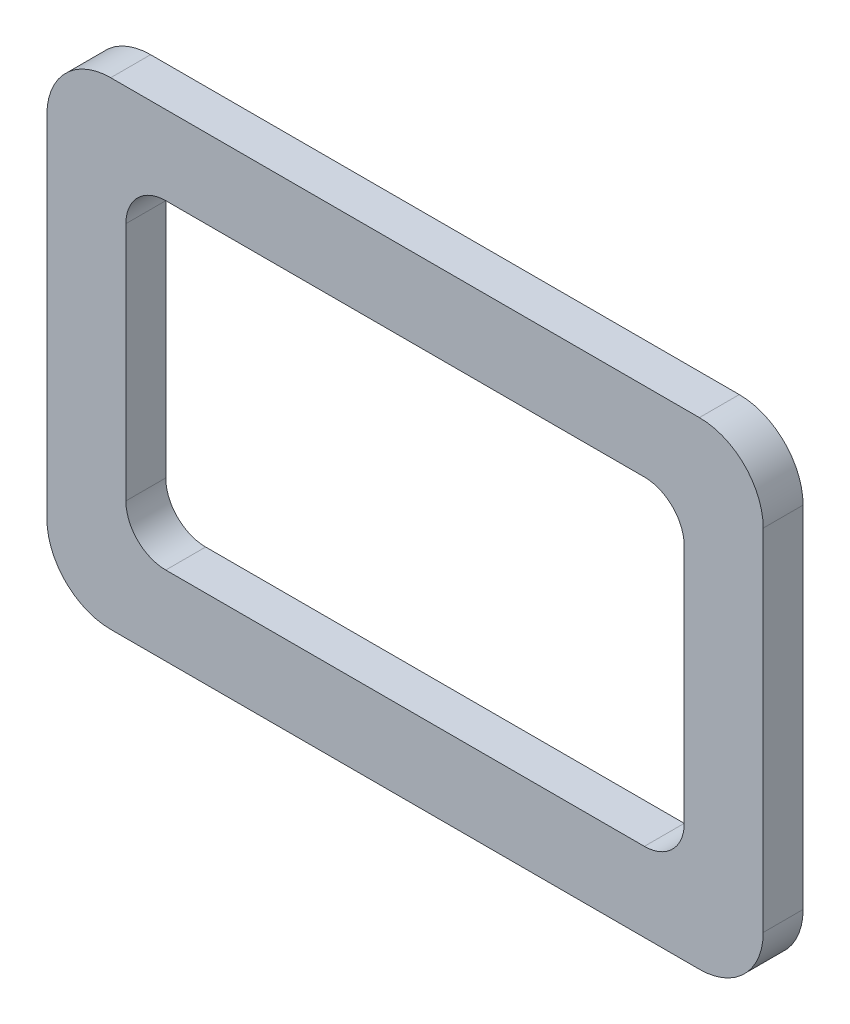
ISO-10303-21;
HEADER;
FILE_DESCRIPTION(('STEP AP214'),'2;1');
FILE_NAME('part.step','',(''),(''),'','','');
FILE_SCHEMA(('AUTOMOTIVE_DESIGN { 1 0 10303 214 1 1 1 1 }'));
ENDSEC;
DATA;
#1=APPLICATION_CONTEXT('core data for automotive mechanical design processes');
#2=APPLICATION_PROTOCOL_DEFINITION('international standard','automotive_design',2000,#1);
#3=PRODUCT_CONTEXT('',#1,'mechanical');
#4=PRODUCT('Part','Part','',(#3));
#5=PRODUCT_RELATED_PRODUCT_CATEGORY('part','',(#4));
#6=PRODUCT_DEFINITION_FORMATION('','',#4);
#7=PRODUCT_DEFINITION_CONTEXT('part definition',#1,'design');
#8=PRODUCT_DEFINITION('design','',#6,#7);
#9=PRODUCT_DEFINITION_SHAPE('','',#8);
#10=(LENGTH_UNIT() NAMED_UNIT(*) SI_UNIT(.MILLI.,.METRE.));
#11=(NAMED_UNIT(*) PLANE_ANGLE_UNIT() SI_UNIT($,.RADIAN.));
#12=(NAMED_UNIT(*) SI_UNIT($,.STERADIAN.) SOLID_ANGLE_UNIT());
#13=UNCERTAINTY_MEASURE_WITH_UNIT(LENGTH_MEASURE(1.E-05),#10,'distance_accuracy_value','');
#14=(GEOMETRIC_REPRESENTATION_CONTEXT(3) GLOBAL_UNCERTAINTY_ASSIGNED_CONTEXT((#13)) GLOBAL_UNIT_ASSIGNED_CONTEXT((#10,
#11,#12)) REPRESENTATION_CONTEXT('',''));
#15=CARTESIAN_POINT('',(0.,0.,0.));
#16=DIRECTION('',(0.,0.,1.));
#17=DIRECTION('',(1.,0.,0.));
#18=AXIS2_PLACEMENT_3D('',#15,#16,#17);
#19=CARTESIAN_POINT('',(49.5119476559096,-3.74892720306512,5.));
#20=DIRECTION('',(0.,-1.,0.));
#21=DIRECTION('',(1.,0.,0.));
#22=AXIS2_PLACEMENT_3D('',#19,#20,#21);
#23=PLANE('',#22);
#24=DIRECTION('',(-1.,0.,0.));
#25=VECTOR('',#24,1.);
#26=CARTESIAN_POINT('',(49.5119476559096,-3.74892720306512,5.));
#27=LINE('',#26,#25);
#28=CARTESIAN_POINT('',(79.5119476559096,-3.74892720306512,5.));
#29=VERTEX_POINT('',#28);
#30=CARTESIAN_POINT('',(19.5119476559096,-3.74892720306512,5.));
#31=VERTEX_POINT('',#30);
#32=EDGE_CURVE('E308',#29,#31,#27,.T.);
#33=ORIENTED_EDGE('',*,*,#32,.F.);
#34=DIRECTION('',(0.,0.,-1.));
#35=VECTOR('',#34,1.);
#36=CARTESIAN_POINT('',(79.5119476559096,-3.74892720306512,5.));
#37=LINE('',#36,#35);
#38=CARTESIAN_POINT('',(79.5119476559096,-3.74892720306512,0.));
#39=VERTEX_POINT('',#38);
#40=EDGE_CURVE('E240',#29,#39,#37,.T.);
#41=ORIENTED_EDGE('',*,*,#40,.T.);
#42=DIRECTION('',(-1.,0.,0.));
#43=VECTOR('',#42,1.);
#44=CARTESIAN_POINT('',(49.5119476559096,-3.74892720306512,0.));
#45=LINE('',#44,#43);
#46=CARTESIAN_POINT('',(19.5119476559096,-3.74892720306512,0.));
#47=VERTEX_POINT('',#46);
#48=EDGE_CURVE('E295',#39,#47,#45,.T.);
#49=ORIENTED_EDGE('',*,*,#48,.T.);
#50=DIRECTION('',(0.,0.,-1.));
#51=VECTOR('',#50,1.);
#52=CARTESIAN_POINT('',(19.5119476559096,-3.74892720306512,5.));
#53=LINE('',#52,#51);
#54=EDGE_CURVE('E237',#47,#31,#53,.F.);
#55=ORIENTED_EDGE('',*,*,#54,.T.);
#56=EDGE_LOOP('',(#33,#41,#49,#55));
#57=FACE_BOUND('',#56,.T.);
#58=ADVANCED_FACE('F43',(#57),#23,.F.);
#59=CARTESIAN_POINT('',(14.5119476559096,-3.74892720306512,5.));
#60=DIRECTION('',(-1.,0.,0.));
#61=DIRECTION('',(0.,0.,1.));
#62=AXIS2_PLACEMENT_3D('',#59,#60,#61);
#63=PLANE('',#62);
#64=DIRECTION('',(0.,1.,0.));
#65=VECTOR('',#64,1.);
#66=CARTESIAN_POINT('',(14.5119476559096,-3.74892720306512,5.));
#67=LINE('',#66,#65);
#68=CARTESIAN_POINT('',(14.5119476559096,1.25107279693488,5.));
#69=VERTEX_POINT('',#68);
#70=CARTESIAN_POINT('',(14.5119476559096,31.3510727969349,5.));
#71=VERTEX_POINT('',#70);
#72=EDGE_CURVE('E302',#69,#71,#67,.T.);
#73=ORIENTED_EDGE('',*,*,#72,.F.);
#74=DIRECTION('',(0.,0.,-1.));
#75=VECTOR('',#74,1.);
#76=CARTESIAN_POINT('',(14.5119476559096,1.25107279693488,0.));
#77=LINE('',#76,#75);
#78=CARTESIAN_POINT('',(14.5119476559096,1.25107279693488,0.));
#79=VERTEX_POINT('',#78);
#80=EDGE_CURVE('E254',#69,#79,#77,.T.);
#81=ORIENTED_EDGE('',*,*,#80,.T.);
#82=DIRECTION('',(0.,1.,0.));
#83=VECTOR('',#82,1.);
#84=CARTESIAN_POINT('',(14.5119476559096,-3.74892720306512,0.));
#85=LINE('',#84,#83);
#86=CARTESIAN_POINT('',(14.5119476559096,31.3510727969349,0.));
#87=VERTEX_POINT('',#86);
#88=EDGE_CURVE('E285',#79,#87,#85,.T.);
#89=ORIENTED_EDGE('',*,*,#88,.T.);
#90=DIRECTION('',(0.,0.,-1.));
#91=VECTOR('',#90,1.);
#92=CARTESIAN_POINT('',(14.5119476559096,31.3510727969349,5.));
#93=LINE('',#92,#91);
#94=EDGE_CURVE('E251',#87,#71,#93,.F.);
#95=ORIENTED_EDGE('',*,*,#94,.T.);
#96=EDGE_LOOP('',(#73,#81,#89,#95));
#97=FACE_BOUND('',#96,.T.);
#98=ADVANCED_FACE('F292',(#97),#63,.F.);
#99=CARTESIAN_POINT('',(49.5119476559096,36.3510727969349,5.));
#100=DIRECTION('',(0.,1.,0.));
#101=DIRECTION('',(-1.,0.,0.));
#102=AXIS2_PLACEMENT_3D('',#99,#100,#101);
#103=PLANE('',#102);
#104=DIRECTION('',(1.,0.,0.));
#105=VECTOR('',#104,1.);
#106=CARTESIAN_POINT('',(49.5119476559096,36.3510727969349,0.));
#107=LINE('',#106,#105);
#108=CARTESIAN_POINT('',(19.5119476559096,36.3510727969349,0.));
#109=VERTEX_POINT('',#108);
#110=CARTESIAN_POINT('',(79.5119476559096,36.3510727969349,0.));
#111=VERTEX_POINT('',#110);
#112=EDGE_CURVE('E286',#109,#111,#107,.T.);
#113=ORIENTED_EDGE('',*,*,#112,.T.);
#114=DIRECTION('',(0.,0.,-1.));
#115=VECTOR('',#114,1.);
#116=CARTESIAN_POINT('',(79.5119476559096,36.3510727969349,5.));
#117=LINE('',#116,#115);
#118=CARTESIAN_POINT('',(79.5119476559096,36.3510727969349,5.));
#119=VERTEX_POINT('',#118);
#120=EDGE_CURVE('E59',#111,#119,#117,.F.);
#121=ORIENTED_EDGE('',*,*,#120,.T.);
#122=DIRECTION('',(1.,0.,0.));
#123=VECTOR('',#122,1.);
#124=CARTESIAN_POINT('',(49.5119476559096,36.3510727969349,5.));
#125=LINE('',#124,#123);
#126=CARTESIAN_POINT('',(19.5119476559096,36.3510727969349,5.));
#127=VERTEX_POINT('',#126);
#128=EDGE_CURVE('E298',#127,#119,#125,.T.);
#129=ORIENTED_EDGE('',*,*,#128,.F.);
#130=DIRECTION('',(0.,0.,-1.));
#131=VECTOR('',#130,1.);
#132=CARTESIAN_POINT('',(19.5119476559096,36.3510727969349,0.));
#133=LINE('',#132,#131);
#134=EDGE_CURVE('E258',#127,#109,#133,.T.);
#135=ORIENTED_EDGE('',*,*,#134,.T.);
#136=EDGE_LOOP('',(#113,#121,#129,#135));
#137=FACE_BOUND('',#136,.T.);
#138=ADVANCED_FACE('F297',(#137),#103,.F.);
#139=CARTESIAN_POINT('',(49.5119476559096,46.2510727969349,5.));
#140=DIRECTION('',(0.,-1.,0.));
#141=DIRECTION('',(1.,0.,0.));
#142=AXIS2_PLACEMENT_3D('',#139,#140,#141);
#143=PLANE('',#142);
#144=DIRECTION('',(-1.,0.,0.));
#145=VECTOR('',#144,1.);
#146=CARTESIAN_POINT('',(49.5119476559096,46.2510727969349,5.));
#147=LINE('',#146,#145);
#148=CARTESIAN_POINT('',(86.4119476559096,46.2510727969349,5.));
#149=VERTEX_POINT('',#148);
#150=CARTESIAN_POINT('',(12.6119476559096,46.2510727969349,5.));
#151=VERTEX_POINT('',#150);
#152=EDGE_CURVE('E301',#149,#151,#147,.T.);
#153=ORIENTED_EDGE('',*,*,#152,.F.);
#154=DIRECTION('',(0.,0.,-1.));
#155=VECTOR('',#154,1.);
#156=CARTESIAN_POINT('',(86.4119476559096,46.2510727969349,0.));
#157=LINE('',#156,#155);
#158=CARTESIAN_POINT('',(86.4119476559096,46.2510727969349,0.));
#159=VERTEX_POINT('',#158);
#160=EDGE_CURVE('E227',#149,#159,#157,.T.);
#161=ORIENTED_EDGE('',*,*,#160,.T.);
#162=DIRECTION('',(-1.,0.,0.));
#163=VECTOR('',#162,1.);
#164=CARTESIAN_POINT('',(49.5119476559096,46.2510727969349,0.));
#165=LINE('',#164,#163);
#166=CARTESIAN_POINT('',(12.6119476559096,46.2510727969349,0.));
#167=VERTEX_POINT('',#166);
#168=EDGE_CURVE('E163',#159,#167,#165,.T.);
#169=ORIENTED_EDGE('',*,*,#168,.T.);
#170=DIRECTION('',(0.,0.,-1.));
#171=VECTOR('',#170,1.);
#172=CARTESIAN_POINT('',(12.6119476559096,46.2510727969349,5.));
#173=LINE('',#172,#171);
#174=EDGE_CURVE('E224',#167,#151,#173,.F.);
#175=ORIENTED_EDGE('',*,*,#174,.T.);
#176=EDGE_LOOP('',(#153,#161,#169,#175));
#177=FACE_BOUND('',#176,.T.);
#178=ADVANCED_FACE('F366',(#177),#143,.F.);
#179=CARTESIAN_POINT('',(4.61194765590964,-13.6489272030651,5.));
#180=DIRECTION('',(1.,0.,0.));
#181=DIRECTION('',(0.,0.,-1.));
#182=AXIS2_PLACEMENT_3D('',#179,#180,#181);
#183=PLANE('',#182);
#184=DIRECTION('',(0.,-1.,0.));
#185=VECTOR('',#184,1.);
#186=CARTESIAN_POINT('',(4.61194765590964,-13.6489272030651,0.));
#187=LINE('',#186,#185);
#188=CARTESIAN_POINT('',(4.61194765590964,38.2510727969349,0.));
#189=VERTEX_POINT('',#188);
#190=CARTESIAN_POINT('',(4.61194765590964,-5.64892720306513,0.));
#191=VERTEX_POINT('',#190);
#192=EDGE_CURVE('E322',#189,#191,#187,.T.);
#193=ORIENTED_EDGE('',*,*,#192,.T.);
#194=DIRECTION('',(0.,0.,-1.));
#195=VECTOR('',#194,1.);
#196=CARTESIAN_POINT('',(4.61194765590964,-5.64892720306513,5.));
#197=LINE('',#196,#195);
#198=CARTESIAN_POINT('',(4.61194765590964,-5.64892720306513,5.));
#199=VERTEX_POINT('',#198);
#200=EDGE_CURVE('E234',#191,#199,#197,.F.);
#201=ORIENTED_EDGE('',*,*,#200,.T.);
#202=DIRECTION('',(0.,-1.,0.));
#203=VECTOR('',#202,1.);
#204=CARTESIAN_POINT('',(4.61194765590964,-13.6489272030651,5.));
#205=LINE('',#204,#203);
#206=CARTESIAN_POINT('',(4.61194765590964,38.2510727969349,5.));
#207=VERTEX_POINT('',#206);
#208=EDGE_CURVE('E194',#207,#199,#205,.T.);
#209=ORIENTED_EDGE('',*,*,#208,.F.);
#210=DIRECTION('',(0.,0.,-1.));
#211=VECTOR('',#210,1.);
#212=CARTESIAN_POINT('',(4.61194765590964,38.2510727969349,5.));
#213=LINE('',#212,#211);
#214=EDGE_CURVE('E230',#207,#189,#213,.T.);
#215=ORIENTED_EDGE('',*,*,#214,.T.);
#216=EDGE_LOOP('',(#193,#201,#209,#215));
#217=FACE_BOUND('',#216,.T.);
#218=ADVANCED_FACE('F360',(#217),#183,.F.);
#219=CARTESIAN_POINT('',(49.5119476559096,-13.6489272030651,5.));
#220=DIRECTION('',(0.,1.,0.));
#221=DIRECTION('',(-1.,0.,0.));
#222=AXIS2_PLACEMENT_3D('',#219,#220,#221);
#223=PLANE('',#222);
#224=DIRECTION('',(1.,0.,0.));
#225=VECTOR('',#224,1.);
#226=CARTESIAN_POINT('',(49.5119476559096,-13.6489272030651,0.));
#227=LINE('',#226,#225);
#228=CARTESIAN_POINT('',(12.6119476559096,-13.6489272030651,0.));
#229=VERTEX_POINT('',#228);
#230=CARTESIAN_POINT('',(86.4119476559096,-13.6489272030651,0.));
#231=VERTEX_POINT('',#230);
#232=EDGE_CURVE('E197',#229,#231,#227,.T.);
#233=ORIENTED_EDGE('',*,*,#232,.T.);
#234=DIRECTION('',(0.,0.,-1.));
#235=VECTOR('',#234,1.);
#236=CARTESIAN_POINT('',(86.4119476559096,-13.6489272030651,5.));
#237=LINE('',#236,#235);
#238=CARTESIAN_POINT('',(86.4119476559096,-13.6489272030651,5.));
#239=VERTEX_POINT('',#238);
#240=EDGE_CURVE('E210',#231,#239,#237,.F.);
#241=ORIENTED_EDGE('',*,*,#240,.T.);
#242=DIRECTION('',(1.,0.,0.));
#243=VECTOR('',#242,1.);
#244=CARTESIAN_POINT('',(49.5119476559096,-13.6489272030651,5.));
#245=LINE('',#244,#243);
#246=CARTESIAN_POINT('',(12.6119476559096,-13.6489272030651,5.));
#247=VERTEX_POINT('',#246);
#248=EDGE_CURVE('E187',#247,#239,#245,.T.);
#249=ORIENTED_EDGE('',*,*,#248,.F.);
#250=DIRECTION('',(0.,0.,-1.));
#251=VECTOR('',#250,1.);
#252=CARTESIAN_POINT('',(12.6119476559096,-13.6489272030651,5.));
#253=LINE('',#252,#251);
#254=EDGE_CURVE('E206',#247,#229,#253,.T.);
#255=ORIENTED_EDGE('',*,*,#254,.T.);
#256=EDGE_LOOP('',(#233,#241,#249,#255));
#257=FACE_BOUND('',#256,.T.);
#258=ADVANCED_FACE('F355',(#257),#223,.F.);
#259=CARTESIAN_POINT('',(0.,0.,5.));
#260=DIRECTION('',(0.,0.,1.));
#261=DIRECTION('',(1.,0.,0.));
#262=AXIS2_PLACEMENT_3D('',#259,#260,#261);
#263=PLANE('',#262);
#264=ORIENTED_EDGE('',*,*,#248,.T.);
#265=CARTESIAN_POINT('',(86.4119476559096,-5.64892720306512,5.));
#266=DIRECTION('',(0.,0.,1.));
#267=DIRECTION('',(1.,0.,0.));
#268=AXIS2_PLACEMENT_3D('',#265,#266,#267);
#269=CIRCLE('',#268,8.);
#270=CARTESIAN_POINT('',(94.4119476559096,-5.64892720306512,5.));
#271=VERTEX_POINT('',#270);
#272=EDGE_CURVE('E221',#239,#271,#269,.T.);
#273=ORIENTED_EDGE('',*,*,#272,.T.);
#274=DIRECTION('',(0.,-1.,0.));
#275=VECTOR('',#274,1.);
#276=CARTESIAN_POINT('',(94.4119476559096,-13.6489272030651,5.));
#277=LINE('',#276,#275);
#278=CARTESIAN_POINT('',(94.4119476559096,38.2510727969349,5.));
#279=VERTEX_POINT('',#278);
#280=EDGE_CURVE('E340',#279,#271,#277,.T.);
#281=ORIENTED_EDGE('',*,*,#280,.F.);
#282=CARTESIAN_POINT('',(86.4119476559096,38.2510727969349,5.));
#283=DIRECTION('',(0.,0.,1.));
#284=DIRECTION('',(1.,0.,0.));
#285=AXIS2_PLACEMENT_3D('',#282,#283,#284);
#286=CIRCLE('',#285,8.);
#287=EDGE_CURVE('E185',#279,#149,#286,.T.);
#288=ORIENTED_EDGE('',*,*,#287,.T.);
#289=ORIENTED_EDGE('',*,*,#152,.T.);
#290=CARTESIAN_POINT('',(12.6119476559096,38.2510727969349,5.));
#291=DIRECTION('',(0.,0.,1.));
#292=DIRECTION('',(1.,0.,0.));
#293=AXIS2_PLACEMENT_3D('',#290,#291,#292);
#294=CIRCLE('',#293,8.);
#295=EDGE_CURVE('E213',#151,#207,#294,.T.);
#296=ORIENTED_EDGE('',*,*,#295,.T.);
#297=ORIENTED_EDGE('',*,*,#208,.T.);
#298=CARTESIAN_POINT('',(12.6119476559096,-5.64892720306512,5.));
#299=DIRECTION('',(0.,0.,1.));
#300=DIRECTION('',(1.,0.,0.));
#301=AXIS2_PLACEMENT_3D('',#298,#299,#300);
#302=CIRCLE('',#301,8.);
#303=EDGE_CURVE('E216',#199,#247,#302,.T.);
#304=ORIENTED_EDGE('',*,*,#303,.T.);
#305=EDGE_LOOP('',(#264,#273,#281,#288,#289,#296,#297,#304));
#306=FACE_BOUND('',#305,.T.);
#307=DIRECTION('',(0.,1.,0.));
#308=VECTOR('',#307,1.);
#309=CARTESIAN_POINT('',(84.5119476559096,-3.74892720306512,5.));
#310=LINE('',#309,#308);
#311=CARTESIAN_POINT('',(84.5119476559096,1.25107279693488,5.));
#312=VERTEX_POINT('',#311);
#313=CARTESIAN_POINT('',(84.5119476559096,31.3510727969349,5.));
#314=VERTEX_POINT('',#313);
#315=EDGE_CURVE('E317',#312,#314,#310,.T.);
#316=ORIENTED_EDGE('',*,*,#315,.F.);
#317=CARTESIAN_POINT('',(79.5119476559096,1.25107279693488,5.));
#318=DIRECTION('',(0.,0.,1.));
#319=DIRECTION('',(1.,0.,0.));
#320=AXIS2_PLACEMENT_3D('',#317,#318,#319);
#321=CIRCLE('',#320,5.);
#322=EDGE_CURVE('E267',#312,#29,#321,.F.);
#323=ORIENTED_EDGE('',*,*,#322,.T.);
#324=ORIENTED_EDGE('',*,*,#32,.T.);
#325=CARTESIAN_POINT('',(19.5119476559096,1.25107279693488,5.));
#326=DIRECTION('',(0.,0.,1.));
#327=DIRECTION('',(1.,0.,0.));
#328=AXIS2_PLACEMENT_3D('',#325,#326,#327);
#329=CIRCLE('',#328,5.);
#330=EDGE_CURVE('E273',#31,#69,#329,.F.);
#331=ORIENTED_EDGE('',*,*,#330,.T.);
#332=ORIENTED_EDGE('',*,*,#72,.T.);
#333=CARTESIAN_POINT('',(19.5119476559096,31.3510727969349,5.));
#334=DIRECTION('',(0.,0.,1.));
#335=DIRECTION('',(1.,0.,0.));
#336=AXIS2_PLACEMENT_3D('',#333,#334,#335);
#337=CIRCLE('',#336,5.);
#338=EDGE_CURVE('E11',#71,#127,#337,.F.);
#339=ORIENTED_EDGE('',*,*,#338,.T.);
#340=ORIENTED_EDGE('',*,*,#128,.T.);
#341=CARTESIAN_POINT('',(79.5119476559096,31.3510727969349,5.));
#342=DIRECTION('',(0.,0.,1.));
#343=DIRECTION('',(1.,0.,0.));
#344=AXIS2_PLACEMENT_3D('',#341,#342,#343);
#345=CIRCLE('',#344,5.);
#346=EDGE_CURVE('E279',#119,#314,#345,.F.);
#347=ORIENTED_EDGE('',*,*,#346,.T.);
#348=EDGE_LOOP('',(#316,#323,#324,#331,#332,#339,#340,#347));
#349=FACE_BOUND('',#348,.T.);
#350=ADVANCED_FACE('F356',(#306,#349),#263,.T.);
#351=CARTESIAN_POINT('',(0.,0.,0.));
#352=DIRECTION('',(0.,0.,1.));
#353=DIRECTION('',(1.,0.,0.));
#354=AXIS2_PLACEMENT_3D('',#351,#352,#353);
#355=PLANE('',#354);
#356=DIRECTION('',(0.,-1.,0.));
#357=VECTOR('',#356,1.);
#358=CARTESIAN_POINT('',(94.4119476559096,-13.6489272030651,0.));
#359=LINE('',#358,#357);
#360=CARTESIAN_POINT('',(94.4119476559096,38.2510727969349,0.));
#361=VERTEX_POINT('',#360);
#362=CARTESIAN_POINT('',(94.4119476559096,-5.64892720306512,0.));
#363=VERTEX_POINT('',#362);
#364=EDGE_CURVE('E161',#361,#363,#359,.T.);
#365=ORIENTED_EDGE('',*,*,#364,.T.);
#366=CARTESIAN_POINT('',(86.4119476559096,-5.64892720306512,0.));
#367=DIRECTION('',(0.,0.,1.));
#368=DIRECTION('',(1.,0.,0.));
#369=AXIS2_PLACEMENT_3D('',#366,#367,#368);
#370=CIRCLE('',#369,8.);
#371=EDGE_CURVE('E169',#363,#231,#370,.F.);
#372=ORIENTED_EDGE('',*,*,#371,.T.);
#373=ORIENTED_EDGE('',*,*,#232,.F.);
#374=CARTESIAN_POINT('',(12.6119476559096,-5.64892720306512,0.));
#375=DIRECTION('',(0.,0.,1.));
#376=DIRECTION('',(1.,0.,0.));
#377=AXIS2_PLACEMENT_3D('',#374,#375,#376);
#378=CIRCLE('',#377,8.);
#379=EDGE_CURVE('E170',#229,#191,#378,.F.);
#380=ORIENTED_EDGE('',*,*,#379,.T.);
#381=ORIENTED_EDGE('',*,*,#192,.F.);
#382=CARTESIAN_POINT('',(12.6119476559096,38.2510727969349,0.));
#383=DIRECTION('',(0.,0.,1.));
#384=DIRECTION('',(1.,0.,0.));
#385=AXIS2_PLACEMENT_3D('',#382,#383,#384);
#386=CIRCLE('',#385,8.);
#387=EDGE_CURVE('E191',#189,#167,#386,.F.);
#388=ORIENTED_EDGE('',*,*,#387,.T.);
#389=ORIENTED_EDGE('',*,*,#168,.F.);
#390=CARTESIAN_POINT('',(86.4119476559096,38.2510727969349,0.));
#391=DIRECTION('',(0.,0.,1.));
#392=DIRECTION('',(1.,0.,0.));
#393=AXIS2_PLACEMENT_3D('',#390,#391,#392);
#394=CIRCLE('',#393,8.);
#395=EDGE_CURVE('E157',#159,#361,#394,.F.);
#396=ORIENTED_EDGE('',*,*,#395,.T.);
#397=EDGE_LOOP('',(#365,#372,#373,#380,#381,#388,#389,#396));
#398=FACE_BOUND('',#397,.T.);
#399=ORIENTED_EDGE('',*,*,#88,.F.);
#400=CARTESIAN_POINT('',(19.5119476559096,1.25107279693488,0.));
#401=DIRECTION('',(0.,0.,1.));
#402=DIRECTION('',(1.,0.,0.));
#403=AXIS2_PLACEMENT_3D('',#400,#401,#402);
#404=CIRCLE('',#403,5.);
#405=EDGE_CURVE('E270',#79,#47,#404,.T.);
#406=ORIENTED_EDGE('',*,*,#405,.T.);
#407=ORIENTED_EDGE('',*,*,#48,.F.);
#408=CARTESIAN_POINT('',(79.5119476559096,1.25107279693488,0.));
#409=DIRECTION('',(0.,0.,1.));
#410=DIRECTION('',(1.,0.,0.));
#411=AXIS2_PLACEMENT_3D('',#408,#409,#410);
#412=CIRCLE('',#411,5.);
#413=CARTESIAN_POINT('',(84.5119476559096,1.25107279693488,0.));
#414=VERTEX_POINT('',#413);
#415=EDGE_CURVE('E264',#39,#414,#412,.T.);
#416=ORIENTED_EDGE('',*,*,#415,.T.);
#417=DIRECTION('',(0.,1.,0.));
#418=VECTOR('',#417,1.);
#419=CARTESIAN_POINT('',(84.5119476559096,-3.74892720306512,0.));
#420=LINE('',#419,#418);
#421=CARTESIAN_POINT('',(84.5119476559096,31.3510727969349,0.));
#422=VERTEX_POINT('',#421);
#423=EDGE_CURVE('E181',#414,#422,#420,.T.);
#424=ORIENTED_EDGE('',*,*,#423,.T.);
#425=CARTESIAN_POINT('',(79.5119476559096,31.3510727969349,0.));
#426=DIRECTION('',(0.,0.,1.));
#427=DIRECTION('',(1.,0.,0.));
#428=AXIS2_PLACEMENT_3D('',#425,#426,#427);
#429=CIRCLE('',#428,5.);
#430=EDGE_CURVE('E276',#422,#111,#429,.T.);
#431=ORIENTED_EDGE('',*,*,#430,.T.);
#432=ORIENTED_EDGE('',*,*,#112,.F.);
#433=CARTESIAN_POINT('',(19.5119476559096,31.3510727969349,0.));
#434=DIRECTION('',(0.,0.,1.));
#435=DIRECTION('',(1.,0.,0.));
#436=AXIS2_PLACEMENT_3D('',#433,#434,#435);
#437=CIRCLE('',#436,5.);
#438=EDGE_CURVE('E52',#109,#87,#437,.T.);
#439=ORIENTED_EDGE('',*,*,#438,.T.);
#440=EDGE_LOOP('',(#399,#406,#407,#416,#424,#431,#432,#439));
#441=FACE_BOUND('',#440,.T.);
#442=ADVANCED_FACE('F159',(#398,#441),#355,.F.);
#443=CARTESIAN_POINT('',(94.4119476559096,-13.6489272030651,5.));
#444=DIRECTION('',(1.,0.,0.));
#445=DIRECTION('',(0.,0.,-1.));
#446=AXIS2_PLACEMENT_3D('',#443,#444,#445);
#447=PLANE('',#446);
#448=ORIENTED_EDGE('',*,*,#280,.T.);
#449=DIRECTION('',(0.,0.,-1.));
#450=VECTOR('',#449,1.);
#451=CARTESIAN_POINT('',(94.4119476559096,-5.64892720306512,0.));
#452=LINE('',#451,#450);
#453=EDGE_CURVE('E179',#271,#363,#452,.T.);
#454=ORIENTED_EDGE('',*,*,#453,.T.);
#455=ORIENTED_EDGE('',*,*,#364,.F.);
#456=DIRECTION('',(0.,0.,-1.));
#457=VECTOR('',#456,1.);
#458=CARTESIAN_POINT('',(94.4119476559096,38.2510727969349,5.));
#459=LINE('',#458,#457);
#460=EDGE_CURVE('E176',#361,#279,#459,.F.);
#461=ORIENTED_EDGE('',*,*,#460,.T.);
#462=EDGE_LOOP('',(#448,#454,#455,#461));
#463=FACE_BOUND('',#462,.T.);
#464=ADVANCED_FACE('F175',(#463),#447,.T.);
#465=CARTESIAN_POINT('',(84.5119476559096,-3.74892720306512,5.));
#466=DIRECTION('',(-1.,0.,0.));
#467=DIRECTION('',(0.,0.,1.));
#468=AXIS2_PLACEMENT_3D('',#465,#466,#467);
#469=PLANE('',#468);
#470=ORIENTED_EDGE('',*,*,#423,.F.);
#471=DIRECTION('',(0.,0.,-1.));
#472=VECTOR('',#471,1.);
#473=CARTESIAN_POINT('',(84.5119476559096,1.25107279693488,5.));
#474=LINE('',#473,#472);
#475=EDGE_CURVE('E248',#414,#312,#474,.F.);
#476=ORIENTED_EDGE('',*,*,#475,.T.);
#477=ORIENTED_EDGE('',*,*,#315,.T.);
#478=DIRECTION('',(0.,0.,-1.));
#479=VECTOR('',#478,1.);
#480=CARTESIAN_POINT('',(84.5119476559096,31.3510727969349,5.));
#481=LINE('',#480,#479);
#482=EDGE_CURVE('E244',#314,#422,#481,.T.);
#483=ORIENTED_EDGE('',*,*,#482,.T.);
#484=EDGE_LOOP('',(#470,#476,#477,#483));
#485=FACE_BOUND('',#484,.T.);
#486=ADVANCED_FACE('F385',(#485),#469,.T.);
#487=CARTESIAN_POINT('',(86.4119476559096,-5.64892720306512,5.));
#488=DIRECTION('',(0.,0.,1.));
#489=DIRECTION('',(1.,0.,0.));
#490=AXIS2_PLACEMENT_3D('',#487,#488,#489);
#491=CYLINDRICAL_SURFACE('',#490,8.);
#492=ORIENTED_EDGE('',*,*,#272,.F.);
#493=ORIENTED_EDGE('',*,*,#240,.F.);
#494=ORIENTED_EDGE('',*,*,#371,.F.);
#495=ORIENTED_EDGE('',*,*,#453,.F.);
#496=EDGE_LOOP('',(#492,#493,#494,#495));
#497=FACE_BOUND('',#496,.T.);
#498=ADVANCED_FACE('F349',(#497),#491,.T.);
#499=CARTESIAN_POINT('',(86.4119476559096,38.2510727969349,5.));
#500=DIRECTION('',(0.,0.,1.));
#501=DIRECTION('',(1.,0.,0.));
#502=AXIS2_PLACEMENT_3D('',#499,#500,#501);
#503=CYLINDRICAL_SURFACE('',#502,8.);
#504=ORIENTED_EDGE('',*,*,#287,.F.);
#505=ORIENTED_EDGE('',*,*,#460,.F.);
#506=ORIENTED_EDGE('',*,*,#395,.F.);
#507=ORIENTED_EDGE('',*,*,#160,.F.);
#508=EDGE_LOOP('',(#504,#505,#506,#507));
#509=FACE_BOUND('',#508,.T.);
#510=ADVANCED_FACE('F184',(#509),#503,.T.);
#511=CARTESIAN_POINT('',(12.6119476559096,-5.64892720306512,5.));
#512=DIRECTION('',(0.,0.,-1.));
#513=DIRECTION('',(-1.,0.,0.));
#514=AXIS2_PLACEMENT_3D('',#511,#512,#513);
#515=CYLINDRICAL_SURFACE('',#514,8.);
#516=ORIENTED_EDGE('',*,*,#303,.F.);
#517=ORIENTED_EDGE('',*,*,#200,.F.);
#518=ORIENTED_EDGE('',*,*,#379,.F.);
#519=ORIENTED_EDGE('',*,*,#254,.F.);
#520=EDGE_LOOP('',(#516,#517,#518,#519));
#521=FACE_BOUND('',#520,.T.);
#522=ADVANCED_FACE('F353',(#521),#515,.T.);
#523=CARTESIAN_POINT('',(12.6119476559096,38.2510727969349,5.));
#524=DIRECTION('',(0.,0.,-1.));
#525=DIRECTION('',(-1.,0.,0.));
#526=AXIS2_PLACEMENT_3D('',#523,#524,#525);
#527=CYLINDRICAL_SURFACE('',#526,8.);
#528=ORIENTED_EDGE('',*,*,#295,.F.);
#529=ORIENTED_EDGE('',*,*,#174,.F.);
#530=ORIENTED_EDGE('',*,*,#387,.F.);
#531=ORIENTED_EDGE('',*,*,#214,.F.);
#532=EDGE_LOOP('',(#528,#529,#530,#531));
#533=FACE_BOUND('',#532,.T.);
#534=ADVANCED_FACE('F362',(#533),#527,.T.);
#535=CARTESIAN_POINT('',(79.5119476559096,1.25107279693488,5.));
#536=DIRECTION('',(0.,0.,-1.));
#537=DIRECTION('',(-1.,0.,0.));
#538=AXIS2_PLACEMENT_3D('',#535,#536,#537);
#539=CYLINDRICAL_SURFACE('',#538,5.);
#540=ORIENTED_EDGE('',*,*,#322,.F.);
#541=ORIENTED_EDGE('',*,*,#475,.F.);
#542=ORIENTED_EDGE('',*,*,#415,.F.);
#543=ORIENTED_EDGE('',*,*,#40,.F.);
#544=EDGE_LOOP('',(#540,#541,#542,#543));
#545=FACE_BOUND('',#544,.T.);
#546=ADVANCED_FACE('F392',(#545),#539,.F.);
#547=CARTESIAN_POINT('',(19.5119476559096,1.25107279693488,5.));
#548=DIRECTION('',(0.,0.,1.));
#549=DIRECTION('',(1.,0.,0.));
#550=AXIS2_PLACEMENT_3D('',#547,#548,#549);
#551=CYLINDRICAL_SURFACE('',#550,5.);
#552=ORIENTED_EDGE('',*,*,#330,.F.);
#553=ORIENTED_EDGE('',*,*,#54,.F.);
#554=ORIENTED_EDGE('',*,*,#405,.F.);
#555=ORIENTED_EDGE('',*,*,#80,.F.);
#556=EDGE_LOOP('',(#552,#553,#554,#555));
#557=FACE_BOUND('',#556,.T.);
#558=ADVANCED_FACE('F395',(#557),#551,.F.);
#559=CARTESIAN_POINT('',(79.5119476559096,31.3510727969349,5.));
#560=DIRECTION('',(0.,0.,-1.));
#561=DIRECTION('',(-1.,0.,0.));
#562=AXIS2_PLACEMENT_3D('',#559,#560,#561);
#563=CYLINDRICAL_SURFACE('',#562,5.);
#564=ORIENTED_EDGE('',*,*,#346,.F.);
#565=ORIENTED_EDGE('',*,*,#120,.F.);
#566=ORIENTED_EDGE('',*,*,#430,.F.);
#567=ORIENTED_EDGE('',*,*,#482,.F.);
#568=EDGE_LOOP('',(#564,#565,#566,#567));
#569=FACE_BOUND('',#568,.T.);
#570=ADVANCED_FACE('F398',(#569),#563,.F.);
#571=CARTESIAN_POINT('',(19.5119476559096,31.3510727969349,5.));
#572=DIRECTION('',(0.,0.,1.));
#573=DIRECTION('',(1.,0.,0.));
#574=AXIS2_PLACEMENT_3D('',#571,#572,#573);
#575=CYLINDRICAL_SURFACE('',#574,5.);
#576=ORIENTED_EDGE('',*,*,#338,.F.);
#577=ORIENTED_EDGE('',*,*,#94,.F.);
#578=ORIENTED_EDGE('',*,*,#438,.F.);
#579=ORIENTED_EDGE('',*,*,#134,.F.);
#580=EDGE_LOOP('',(#576,#577,#578,#579));
#581=FACE_BOUND('',#580,.T.);
#582=ADVANCED_FACE('F45',(#581),#575,.F.);
#583=CLOSED_SHELL('',(#58,#98,#138,#178,#218,#258,#350,#442,#464,#486,#498,#510,#522,#534,#546,
#558,#570,#582));
#584=MANIFOLD_SOLID_BREP('B2',#583);
#585=ADVANCED_BREP_SHAPE_REPRESENTATION('',(#18,#584),#14);
#586=SHAPE_DEFINITION_REPRESENTATION(#9,#585);
ENDSEC;
END-ISO-10303-21;
